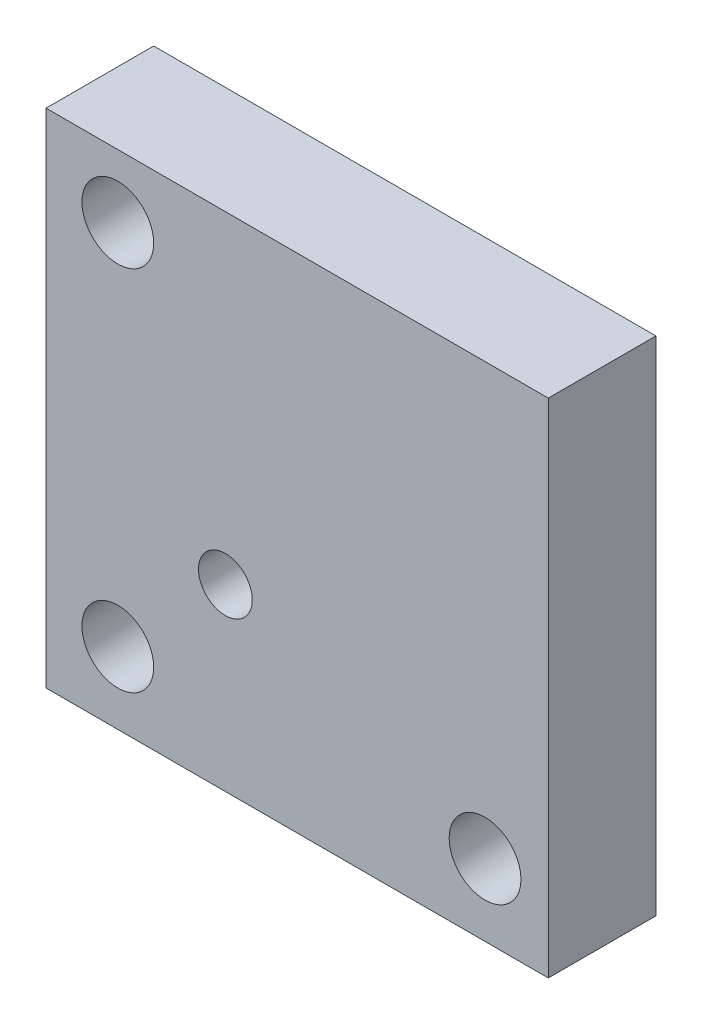
ISO-10303-21;
HEADER;
FILE_DESCRIPTION(('STEP AP214'),'2;1');
FILE_NAME('part.step','',(''),(''),'','','');
FILE_SCHEMA(('AUTOMOTIVE_DESIGN { 1 0 10303 214 1 1 1 1 }'));
ENDSEC;
DATA;
#1=APPLICATION_CONTEXT('core data for automotive mechanical design processes');
#2=APPLICATION_PROTOCOL_DEFINITION('international standard','automotive_design',2000,#1);
#3=PRODUCT_CONTEXT('',#1,'mechanical');
#4=PRODUCT('Part','Part','',(#3));
#5=PRODUCT_RELATED_PRODUCT_CATEGORY('part','',(#4));
#6=PRODUCT_DEFINITION_FORMATION('','',#4);
#7=PRODUCT_DEFINITION_CONTEXT('part definition',#1,'design');
#8=PRODUCT_DEFINITION('design','',#6,#7);
#9=PRODUCT_DEFINITION_SHAPE('','',#8);
#10=(LENGTH_UNIT() NAMED_UNIT(*) SI_UNIT(.MILLI.,.METRE.));
#11=(NAMED_UNIT(*) PLANE_ANGLE_UNIT() SI_UNIT($,.RADIAN.));
#12=(NAMED_UNIT(*) SI_UNIT($,.STERADIAN.) SOLID_ANGLE_UNIT());
#13=UNCERTAINTY_MEASURE_WITH_UNIT(LENGTH_MEASURE(1.E-05),#10,'distance_accuracy_value','');
#14=(GEOMETRIC_REPRESENTATION_CONTEXT(3) GLOBAL_UNCERTAINTY_ASSIGNED_CONTEXT((#13)) GLOBAL_UNIT_ASSIGNED_CONTEXT((#10,
#11,#12)) REPRESENTATION_CONTEXT('',''));
#15=CARTESIAN_POINT('',(0.,0.,0.));
#16=DIRECTION('',(0.,0.,1.));
#17=DIRECTION('',(1.,0.,0.));
#18=AXIS2_PLACEMENT_3D('',#15,#16,#17);
#19=CARTESIAN_POINT('',(22.225,-22.225,9.525));
#20=DIRECTION('',(-1.,0.,0.));
#21=DIRECTION('',(0.,0.,1.));
#22=AXIS2_PLACEMENT_3D('',#19,#20,#21);
#23=PLANE('',#22);
#24=DIRECTION('',(0.,1.,0.));
#25=VECTOR('',#24,1.);
#26=CARTESIAN_POINT('',(22.225,-22.225,0.));
#27=LINE('',#26,#25);
#28=CARTESIAN_POINT('',(22.225,-22.225,0.));
#29=VERTEX_POINT('',#28);
#30=CARTESIAN_POINT('',(22.225,22.225,0.));
#31=VERTEX_POINT('',#30);
#32=EDGE_CURVE('E104',#29,#31,#27,.T.);
#33=ORIENTED_EDGE('',*,*,#32,.T.);
#34=DIRECTION('',(0.,0.,-1.));
#35=VECTOR('',#34,1.);
#36=CARTESIAN_POINT('',(22.225,22.225,9.525));
#37=LINE('',#36,#35);
#38=CARTESIAN_POINT('',(22.225,22.225,9.525));
#39=VERTEX_POINT('',#38);
#40=EDGE_CURVE('E11',#39,#31,#37,.T.);
#41=ORIENTED_EDGE('',*,*,#40,.F.);
#42=DIRECTION('',(0.,1.,0.));
#43=VECTOR('',#42,1.);
#44=CARTESIAN_POINT('',(22.225,-22.225,9.525));
#45=LINE('',#44,#43);
#46=CARTESIAN_POINT('',(22.225,-22.225,9.525));
#47=VERTEX_POINT('',#46);
#48=EDGE_CURVE('E91',#47,#39,#45,.T.);
#49=ORIENTED_EDGE('',*,*,#48,.F.);
#50=DIRECTION('',(0.,0.,-1.));
#51=VECTOR('',#50,1.);
#52=CARTESIAN_POINT('',(22.225,-22.225,9.525));
#53=LINE('',#52,#51);
#54=EDGE_CURVE('E100',#47,#29,#53,.T.);
#55=ORIENTED_EDGE('',*,*,#54,.T.);
#56=EDGE_LOOP('',(#33,#41,#49,#55));
#57=FACE_BOUND('',#56,.T.);
#58=ADVANCED_FACE('F39',(#57),#23,.F.);
#59=CARTESIAN_POINT('',(-22.225,22.225,9.525));
#60=DIRECTION('',(0.,-1.,0.));
#61=DIRECTION('',(0.,0.,-1.));
#62=AXIS2_PLACEMENT_3D('',#59,#60,#61);
#63=PLANE('',#62);
#64=DIRECTION('',(-1.,0.,0.));
#65=VECTOR('',#64,1.);
#66=CARTESIAN_POINT('',(-22.225,22.225,0.));
#67=LINE('',#66,#65);
#68=CARTESIAN_POINT('',(-22.225,22.225,0.));
#69=VERTEX_POINT('',#68);
#70=EDGE_CURVE('E95',#31,#69,#67,.T.);
#71=ORIENTED_EDGE('',*,*,#70,.T.);
#72=DIRECTION('',(0.,0.,-1.));
#73=VECTOR('',#72,1.);
#74=CARTESIAN_POINT('',(-22.225,22.225,9.525));
#75=LINE('',#74,#73);
#76=CARTESIAN_POINT('',(-22.225,22.225,9.525));
#77=VERTEX_POINT('',#76);
#78=EDGE_CURVE('E48',#77,#69,#75,.T.);
#79=ORIENTED_EDGE('',*,*,#78,.F.);
#80=DIRECTION('',(-1.,0.,0.));
#81=VECTOR('',#80,1.);
#82=CARTESIAN_POINT('',(-22.225,22.225,9.525));
#83=LINE('',#82,#81);
#84=EDGE_CURVE('E86',#39,#77,#83,.T.);
#85=ORIENTED_EDGE('',*,*,#84,.F.);
#86=ORIENTED_EDGE('',*,*,#40,.T.);
#87=EDGE_LOOP('',(#71,#79,#85,#86));
#88=FACE_BOUND('',#87,.T.);
#89=ADVANCED_FACE('F94',(#88),#63,.F.);
#90=CARTESIAN_POINT('',(-22.225,-22.225,9.525));
#91=DIRECTION('',(1.,0.,0.));
#92=DIRECTION('',(0.,0.,-1.));
#93=AXIS2_PLACEMENT_3D('',#90,#91,#92);
#94=PLANE('',#93);
#95=DIRECTION('',(0.,-1.,0.));
#96=VECTOR('',#95,1.);
#97=CARTESIAN_POINT('',(-22.225,-22.225,0.));
#98=LINE('',#97,#96);
#99=CARTESIAN_POINT('',(-22.225,-22.225,0.));
#100=VERTEX_POINT('',#99);
#101=EDGE_CURVE('E73',#69,#100,#98,.T.);
#102=ORIENTED_EDGE('',*,*,#101,.T.);
#103=DIRECTION('',(0.,0.,-1.));
#104=VECTOR('',#103,1.);
#105=CARTESIAN_POINT('',(-22.225,-22.225,9.525));
#106=LINE('',#105,#104);
#107=CARTESIAN_POINT('',(-22.225,-22.225,9.525));
#108=VERTEX_POINT('',#107);
#109=EDGE_CURVE('E96',#108,#100,#106,.T.);
#110=ORIENTED_EDGE('',*,*,#109,.F.);
#111=DIRECTION('',(0.,-1.,0.));
#112=VECTOR('',#111,1.);
#113=CARTESIAN_POINT('',(-22.225,-22.225,9.525));
#114=LINE('',#113,#112);
#115=EDGE_CURVE('E89',#77,#108,#114,.T.);
#116=ORIENTED_EDGE('',*,*,#115,.F.);
#117=ORIENTED_EDGE('',*,*,#78,.T.);
#118=EDGE_LOOP('',(#102,#110,#116,#117));
#119=FACE_BOUND('',#118,.T.);
#120=ADVANCED_FACE('F98',(#119),#94,.F.);
#121=CARTESIAN_POINT('',(-22.225,-22.225,9.525));
#122=DIRECTION('',(0.,1.,0.));
#123=DIRECTION('',(0.,0.,1.));
#124=AXIS2_PLACEMENT_3D('',#121,#122,#123);
#125=PLANE('',#124);
#126=DIRECTION('',(1.,0.,0.));
#127=VECTOR('',#126,1.);
#128=CARTESIAN_POINT('',(-22.225,-22.225,0.));
#129=LINE('',#128,#127);
#130=EDGE_CURVE('E79',#100,#29,#129,.T.);
#131=ORIENTED_EDGE('',*,*,#130,.T.);
#132=ORIENTED_EDGE('',*,*,#54,.F.);
#133=DIRECTION('',(1.,0.,0.));
#134=VECTOR('',#133,1.);
#135=CARTESIAN_POINT('',(-22.225,-22.225,9.525));
#136=LINE('',#135,#134);
#137=EDGE_CURVE('E56',#108,#47,#136,.T.);
#138=ORIENTED_EDGE('',*,*,#137,.F.);
#139=ORIENTED_EDGE('',*,*,#109,.T.);
#140=EDGE_LOOP('',(#131,#132,#138,#139));
#141=FACE_BOUND('',#140,.T.);
#142=ADVANCED_FACE('F112',(#141),#125,.F.);
#143=CARTESIAN_POINT('',(0.,0.,9.525));
#144=DIRECTION('',(0.,0.,-1.));
#145=DIRECTION('',(-1.,0.,0.));
#146=AXIS2_PLACEMENT_3D('',#143,#144,#145);
#147=PLANE('',#146);
#148=CARTESIAN_POINT('',(-6.35565314094122,-6.35565314094124,9.525));
#149=DIRECTION('',(0.,0.,-1.));
#150=DIRECTION('',(-1.,0.,0.));
#151=AXIS2_PLACEMENT_3D('',#148,#149,#150);
#152=CIRCLE('',#151,2.38125);
#153=CARTESIAN_POINT('',(-8.73690314094122,-6.35565314094124,9.525));
#154=VERTEX_POINT('',#153);
#155=EDGE_CURVE('E170',#154,#154,#152,.T.);
#156=ORIENTED_EDGE('',*,*,#155,.T.);
#157=EDGE_LOOP('',(#156));
#158=FACE_BOUND('',#157,.T.);
#159=CARTESIAN_POINT('',(-15.875,16.6260831511321,9.525));
#160=DIRECTION('',(0.,0.,-1.));
#161=DIRECTION('',(-1.,0.,0.));
#162=AXIS2_PLACEMENT_3D('',#159,#160,#161);
#163=CIRCLE('',#162,3.175);
#164=CARTESIAN_POINT('',(-19.05,16.6260831511321,9.525));
#165=VERTEX_POINT('',#164);
#166=EDGE_CURVE('E147',#165,#165,#163,.T.);
#167=ORIENTED_EDGE('',*,*,#166,.T.);
#168=EDGE_LOOP('',(#167));
#169=FACE_BOUND('',#168,.T.);
#170=CARTESIAN_POINT('',(16.6260831511321,-15.875,9.525));
#171=DIRECTION('',(0.,0.,-1.));
#172=DIRECTION('',(-1.,0.,0.));
#173=AXIS2_PLACEMENT_3D('',#170,#171,#172);
#174=CIRCLE('',#173,3.175);
#175=CARTESIAN_POINT('',(13.4510831511321,-15.875,9.525));
#176=VERTEX_POINT('',#175);
#177=EDGE_CURVE('E132',#176,#176,#174,.T.);
#178=ORIENTED_EDGE('',*,*,#177,.T.);
#179=EDGE_LOOP('',(#178));
#180=FACE_BOUND('',#179,.T.);
#181=CARTESIAN_POINT('',(-15.875,-15.875,9.525));
#182=DIRECTION('',(0.,0.,-1.));
#183=DIRECTION('',(-1.,0.,0.));
#184=AXIS2_PLACEMENT_3D('',#181,#182,#183);
#185=CIRCLE('',#184,3.175);
#186=CARTESIAN_POINT('',(-19.05,-15.875,9.525));
#187=VERTEX_POINT('',#186);
#188=EDGE_CURVE('E107',#187,#187,#185,.T.);
#189=ORIENTED_EDGE('',*,*,#188,.T.);
#190=EDGE_LOOP('',(#189));
#191=FACE_BOUND('',#190,.T.);
#192=ORIENTED_EDGE('',*,*,#48,.T.);
#193=ORIENTED_EDGE('',*,*,#84,.T.);
#194=ORIENTED_EDGE('',*,*,#115,.T.);
#195=ORIENTED_EDGE('',*,*,#137,.T.);
#196=EDGE_LOOP('',(#192,#193,#194,#195));
#197=FACE_BOUND('',#196,.T.);
#198=ADVANCED_FACE('F87',(#158,#169,#180,#191,#197),#147,.F.);
#199=CARTESIAN_POINT('',(0.,0.,0.));
#200=DIRECTION('',(0.,0.,-1.));
#201=DIRECTION('',(-1.,0.,0.));
#202=AXIS2_PLACEMENT_3D('',#199,#200,#201);
#203=PLANE('',#202);
#204=CARTESIAN_POINT('',(-6.35565314094122,-6.35565314094124,0.));
#205=DIRECTION('',(0.,0.,-1.));
#206=DIRECTION('',(-1.,0.,0.));
#207=AXIS2_PLACEMENT_3D('',#204,#205,#206);
#208=CIRCLE('',#207,6.35);
#209=CARTESIAN_POINT('',(-12.7056531409412,-6.35565314094124,0.));
#210=VERTEX_POINT('',#209);
#211=EDGE_CURVE('E163',#210,#210,#208,.T.);
#212=ORIENTED_EDGE('',*,*,#211,.F.);
#213=EDGE_LOOP('',(#212));
#214=FACE_BOUND('',#213,.T.);
#215=CARTESIAN_POINT('',(-15.875,16.6260831511321,0.));
#216=DIRECTION('',(0.,0.,-1.));
#217=DIRECTION('',(-1.,0.,0.));
#218=AXIS2_PLACEMENT_3D('',#215,#216,#217);
#219=CIRCLE('',#218,3.937);
#220=CARTESIAN_POINT('',(-19.812,16.6260831511321,0.));
#221=VERTEX_POINT('',#220);
#222=EDGE_CURVE('E159',#221,#221,#219,.T.);
#223=ORIENTED_EDGE('',*,*,#222,.F.);
#224=EDGE_LOOP('',(#223));
#225=FACE_BOUND('',#224,.T.);
#226=CARTESIAN_POINT('',(16.6260831511321,-15.875,0.));
#227=DIRECTION('',(0.,0.,-1.));
#228=DIRECTION('',(-1.,0.,0.));
#229=AXIS2_PLACEMENT_3D('',#226,#227,#228);
#230=CIRCLE('',#229,3.937);
#231=CARTESIAN_POINT('',(12.6890831511321,-15.875,0.));
#232=VERTEX_POINT('',#231);
#233=EDGE_CURVE('E144',#232,#232,#230,.T.);
#234=ORIENTED_EDGE('',*,*,#233,.F.);
#235=EDGE_LOOP('',(#234));
#236=FACE_BOUND('',#235,.T.);
#237=CARTESIAN_POINT('',(-15.875,-15.875,0.));
#238=DIRECTION('',(0.,0.,-1.));
#239=DIRECTION('',(-1.,0.,0.));
#240=AXIS2_PLACEMENT_3D('',#237,#238,#239);
#241=CIRCLE('',#240,3.937);
#242=CARTESIAN_POINT('',(-19.812,-15.875,0.));
#243=VERTEX_POINT('',#242);
#244=EDGE_CURVE('E129',#243,#243,#241,.T.);
#245=ORIENTED_EDGE('',*,*,#244,.F.);
#246=EDGE_LOOP('',(#245));
#247=FACE_BOUND('',#246,.T.);
#248=ORIENTED_EDGE('',*,*,#32,.F.);
#249=ORIENTED_EDGE('',*,*,#130,.F.);
#250=ORIENTED_EDGE('',*,*,#101,.F.);
#251=ORIENTED_EDGE('',*,*,#70,.F.);
#252=EDGE_LOOP('',(#248,#249,#250,#251));
#253=FACE_BOUND('',#252,.T.);
#254=ADVANCED_FACE('F115',(#214,#225,#236,#247,#253),#203,.T.);
#255=CARTESIAN_POINT('',(-15.875,-15.875,0.));
#256=DIRECTION('',(0.,0.,-1.));
#257=DIRECTION('',(-1.,0.,0.));
#258=AXIS2_PLACEMENT_3D('',#255,#256,#257);
#259=CYLINDRICAL_SURFACE('',#258,3.175);
#260=ORIENTED_EDGE('',*,*,#188,.F.);
#261=EDGE_LOOP('',(#260));
#262=FACE_BOUND('',#261,.T.);
#263=CARTESIAN_POINT('',(-15.875,-15.875,0.507999999999998));
#264=DIRECTION('',(0.,0.,-1.));
#265=DIRECTION('',(-1.,0.,0.));
#266=AXIS2_PLACEMENT_3D('',#263,#264,#265);
#267=CIRCLE('',#266,3.175);
#268=CARTESIAN_POINT('',(-19.05,-15.875,0.507999999999998));
#269=VERTEX_POINT('',#268);
#270=EDGE_CURVE('E120',#269,#269,#267,.T.);
#271=ORIENTED_EDGE('',*,*,#270,.T.);
#272=EDGE_LOOP('',(#271));
#273=FACE_BOUND('',#272,.T.);
#274=ADVANCED_FACE('F197',(#262,#273),#259,.F.);
#275=CARTESIAN_POINT('',(-12.065,-15.875,0.507999999999998));
#276=DIRECTION('',(0.,0.,1.));
#277=DIRECTION('',(1.,0.,0.));
#278=AXIS2_PLACEMENT_3D('',#275,#276,#277);
#279=PLANE('',#278);
#280=ORIENTED_EDGE('',*,*,#270,.F.);
#281=EDGE_LOOP('',(#280));
#282=FACE_BOUND('',#281,.T.);
#283=CARTESIAN_POINT('',(-15.875,-15.875,0.507999999999998));
#284=DIRECTION('',(0.,0.,-1.));
#285=DIRECTION('',(-1.,0.,0.));
#286=AXIS2_PLACEMENT_3D('',#283,#284,#285);
#287=CIRCLE('',#286,3.81);
#288=CARTESIAN_POINT('',(-19.685,-15.875,0.507999999999998));
#289=VERTEX_POINT('',#288);
#290=EDGE_CURVE('E123',#289,#289,#287,.T.);
#291=ORIENTED_EDGE('',*,*,#290,.T.);
#292=EDGE_LOOP('',(#291));
#293=FACE_BOUND('',#292,.T.);
#294=ADVANCED_FACE('F218',(#282,#293),#279,.F.);
#295=CARTESIAN_POINT('',(-15.875,-15.875,0.));
#296=DIRECTION('',(0.,0.,-1.));
#297=DIRECTION('',(-1.,0.,0.));
#298=AXIS2_PLACEMENT_3D('',#295,#296,#297);
#299=CYLINDRICAL_SURFACE('',#298,3.81);
#300=ORIENTED_EDGE('',*,*,#290,.F.);
#301=EDGE_LOOP('',(#300));
#302=FACE_BOUND('',#301,.T.);
#303=CARTESIAN_POINT('',(-15.875,-15.875,0.127000000000001));
#304=DIRECTION('',(0.,0.,-1.));
#305=DIRECTION('',(-1.,0.,0.));
#306=AXIS2_PLACEMENT_3D('',#303,#304,#305);
#307=CIRCLE('',#306,3.81);
#308=CARTESIAN_POINT('',(-19.685,-15.875,0.127000000000001));
#309=VERTEX_POINT('',#308);
#310=EDGE_CURVE('E126',#309,#309,#307,.T.);
#311=ORIENTED_EDGE('',*,*,#310,.T.);
#312=EDGE_LOOP('',(#311));
#313=FACE_BOUND('',#312,.T.);
#314=ADVANCED_FACE('F208',(#302,#313),#299,.F.);
#315=CARTESIAN_POINT('',(-15.875,-15.875,0.));
#316=DIRECTION('',(0.,0.,-1.));
#317=DIRECTION('',(-1.,0.,0.));
#318=AXIS2_PLACEMENT_3D('',#315,#316,#317);
#319=CONICAL_SURFACE('',#318,3.937,0.785398163397447);
#320=ORIENTED_EDGE('',*,*,#310,.F.);
#321=EDGE_LOOP('',(#320));
#322=FACE_BOUND('',#321,.T.);
#323=ORIENTED_EDGE('',*,*,#244,.T.);
#324=EDGE_LOOP('',(#323));
#325=FACE_BOUND('',#324,.T.);
#326=ADVANCED_FACE('F205',(#322,#325),#319,.F.);
#327=CARTESIAN_POINT('',(16.6260831511321,-15.875,0.));
#328=DIRECTION('',(0.,0.,-1.));
#329=DIRECTION('',(-1.,0.,0.));
#330=AXIS2_PLACEMENT_3D('',#327,#328,#329);
#331=CYLINDRICAL_SURFACE('',#330,3.175);
#332=ORIENTED_EDGE('',*,*,#177,.F.);
#333=EDGE_LOOP('',(#332));
#334=FACE_BOUND('',#333,.T.);
#335=CARTESIAN_POINT('',(16.6260831511321,-15.875,0.507999999999998));
#336=DIRECTION('',(0.,0.,-1.));
#337=DIRECTION('',(-1.,0.,0.));
#338=AXIS2_PLACEMENT_3D('',#335,#336,#337);
#339=CIRCLE('',#338,3.175);
#340=CARTESIAN_POINT('',(13.4510831511321,-15.875,0.507999999999998));
#341=VERTEX_POINT('',#340);
#342=EDGE_CURVE('E135',#341,#341,#339,.T.);
#343=ORIENTED_EDGE('',*,*,#342,.T.);
#344=EDGE_LOOP('',(#343));
#345=FACE_BOUND('',#344,.T.);
#346=ADVANCED_FACE('F207',(#334,#345),#331,.F.);
#347=CARTESIAN_POINT('',(20.4360831511321,-15.875,0.507999999999998));
#348=DIRECTION('',(0.,0.,1.));
#349=DIRECTION('',(1.,0.,0.));
#350=AXIS2_PLACEMENT_3D('',#347,#348,#349);
#351=PLANE('',#350);
#352=ORIENTED_EDGE('',*,*,#342,.F.);
#353=EDGE_LOOP('',(#352));
#354=FACE_BOUND('',#353,.T.);
#355=CARTESIAN_POINT('',(16.6260831511321,-15.875,0.507999999999998));
#356=DIRECTION('',(0.,0.,-1.));
#357=DIRECTION('',(-1.,0.,0.));
#358=AXIS2_PLACEMENT_3D('',#355,#356,#357);
#359=CIRCLE('',#358,3.80999999999999);
#360=CARTESIAN_POINT('',(12.8160831511321,-15.875,0.507999999999998));
#361=VERTEX_POINT('',#360);
#362=EDGE_CURVE('E138',#361,#361,#359,.T.);
#363=ORIENTED_EDGE('',*,*,#362,.T.);
#364=EDGE_LOOP('',(#363));
#365=FACE_BOUND('',#364,.T.);
#366=ADVANCED_FACE('F215',(#354,#365),#351,.F.);
#367=CARTESIAN_POINT('',(16.6260831511321,-15.875,0.));
#368=DIRECTION('',(0.,0.,-1.));
#369=DIRECTION('',(-1.,0.,0.));
#370=AXIS2_PLACEMENT_3D('',#367,#368,#369);
#371=CYLINDRICAL_SURFACE('',#370,3.81);
#372=ORIENTED_EDGE('',*,*,#362,.F.);
#373=EDGE_LOOP('',(#372));
#374=FACE_BOUND('',#373,.T.);
#375=CARTESIAN_POINT('',(16.6260831511321,-15.875,0.127000000000001));
#376=DIRECTION('',(0.,0.,-1.));
#377=DIRECTION('',(-1.,0.,0.));
#378=AXIS2_PLACEMENT_3D('',#375,#376,#377);
#379=CIRCLE('',#378,3.81);
#380=CARTESIAN_POINT('',(12.8160831511321,-15.875,0.127000000000001));
#381=VERTEX_POINT('',#380);
#382=EDGE_CURVE('E141',#381,#381,#379,.T.);
#383=ORIENTED_EDGE('',*,*,#382,.T.);
#384=EDGE_LOOP('',(#383));
#385=FACE_BOUND('',#384,.T.);
#386=ADVANCED_FACE('F273',(#374,#385),#371,.F.);
#387=CARTESIAN_POINT('',(16.6260831511321,-15.875,0.));
#388=DIRECTION('',(0.,0.,-1.));
#389=DIRECTION('',(-1.,0.,0.));
#390=AXIS2_PLACEMENT_3D('',#387,#388,#389);
#391=CONICAL_SURFACE('',#390,3.937,0.785398163397441);
#392=ORIENTED_EDGE('',*,*,#382,.F.);
#393=EDGE_LOOP('',(#392));
#394=FACE_BOUND('',#393,.T.);
#395=ORIENTED_EDGE('',*,*,#233,.T.);
#396=EDGE_LOOP('',(#395));
#397=FACE_BOUND('',#396,.T.);
#398=ADVANCED_FACE('F283',(#394,#397),#391,.F.);
#399=CARTESIAN_POINT('',(-15.875,16.6260831511321,0.));
#400=DIRECTION('',(0.,0.,-1.));
#401=DIRECTION('',(-1.,0.,0.));
#402=AXIS2_PLACEMENT_3D('',#399,#400,#401);
#403=CYLINDRICAL_SURFACE('',#402,3.175);
#404=ORIENTED_EDGE('',*,*,#166,.F.);
#405=EDGE_LOOP('',(#404));
#406=FACE_BOUND('',#405,.T.);
#407=CARTESIAN_POINT('',(-15.875,16.6260831511321,0.507999999999998));
#408=DIRECTION('',(0.,0.,-1.));
#409=DIRECTION('',(-1.,0.,0.));
#410=AXIS2_PLACEMENT_3D('',#407,#408,#409);
#411=CIRCLE('',#410,3.175);
#412=CARTESIAN_POINT('',(-19.05,16.6260831511321,0.507999999999998));
#413=VERTEX_POINT('',#412);
#414=EDGE_CURVE('E150',#413,#413,#411,.T.);
#415=ORIENTED_EDGE('',*,*,#414,.T.);
#416=EDGE_LOOP('',(#415));
#417=FACE_BOUND('',#416,.T.);
#418=ADVANCED_FACE('F293',(#406,#417),#403,.F.);
#419=CARTESIAN_POINT('',(-12.065,16.6260831511321,0.507999999999998));
#420=DIRECTION('',(0.,0.,1.));
#421=DIRECTION('',(1.,0.,0.));
#422=AXIS2_PLACEMENT_3D('',#419,#420,#421);
#423=PLANE('',#422);
#424=ORIENTED_EDGE('',*,*,#414,.F.);
#425=EDGE_LOOP('',(#424));
#426=FACE_BOUND('',#425,.T.);
#427=CARTESIAN_POINT('',(-15.875,16.6260831511321,0.507999999999998));
#428=DIRECTION('',(0.,0.,-1.));
#429=DIRECTION('',(-1.,0.,0.));
#430=AXIS2_PLACEMENT_3D('',#427,#428,#429);
#431=CIRCLE('',#430,3.81);
#432=CARTESIAN_POINT('',(-19.685,16.6260831511321,0.507999999999998));
#433=VERTEX_POINT('',#432);
#434=EDGE_CURVE('E153',#433,#433,#431,.T.);
#435=ORIENTED_EDGE('',*,*,#434,.T.);
#436=EDGE_LOOP('',(#435));
#437=FACE_BOUND('',#436,.T.);
#438=ADVANCED_FACE('F303',(#426,#437),#423,.F.);
#439=CARTESIAN_POINT('',(-15.875,16.6260831511321,0.));
#440=DIRECTION('',(0.,0.,-1.));
#441=DIRECTION('',(-1.,0.,0.));
#442=AXIS2_PLACEMENT_3D('',#439,#440,#441);
#443=CYLINDRICAL_SURFACE('',#442,3.81);
#444=ORIENTED_EDGE('',*,*,#434,.F.);
#445=EDGE_LOOP('',(#444));
#446=FACE_BOUND('',#445,.T.);
#447=CARTESIAN_POINT('',(-15.875,16.6260831511321,0.127000000000001));
#448=DIRECTION('',(0.,0.,-1.));
#449=DIRECTION('',(-1.,0.,0.));
#450=AXIS2_PLACEMENT_3D('',#447,#448,#449);
#451=CIRCLE('',#450,3.81);
#452=CARTESIAN_POINT('',(-19.685,16.6260831511321,0.127000000000001));
#453=VERTEX_POINT('',#452);
#454=EDGE_CURVE('E156',#453,#453,#451,.T.);
#455=ORIENTED_EDGE('',*,*,#454,.T.);
#456=EDGE_LOOP('',(#455));
#457=FACE_BOUND('',#456,.T.);
#458=ADVANCED_FACE('F313',(#446,#457),#443,.F.);
#459=CARTESIAN_POINT('',(-15.875,16.6260831511321,0.));
#460=DIRECTION('',(0.,0.,-1.));
#461=DIRECTION('',(-1.,0.,0.));
#462=AXIS2_PLACEMENT_3D('',#459,#460,#461);
#463=CONICAL_SURFACE('',#462,3.937,0.785398163397447);
#464=ORIENTED_EDGE('',*,*,#454,.F.);
#465=EDGE_LOOP('',(#464));
#466=FACE_BOUND('',#465,.T.);
#467=ORIENTED_EDGE('',*,*,#222,.T.);
#468=EDGE_LOOP('',(#467));
#469=FACE_BOUND('',#468,.T.);
#470=ADVANCED_FACE('F191',(#466,#469),#463,.F.);
#471=CARTESIAN_POINT('',(-6.35565314094122,-6.35565314094124,4.7752));
#472=DIRECTION('',(0.,0.,-1.));
#473=DIRECTION('',(-1.,0.,0.));
#474=AXIS2_PLACEMENT_3D('',#471,#472,#473);
#475=CYLINDRICAL_SURFACE('',#474,6.35);
#476=CARTESIAN_POINT('',(-6.35565314094122,-6.35565314094124,4.7752));
#477=DIRECTION('',(0.,0.,-1.));
#478=DIRECTION('',(-1.,0.,0.));
#479=AXIS2_PLACEMENT_3D('',#476,#477,#478);
#480=CIRCLE('',#479,6.35);
#481=CARTESIAN_POINT('',(-12.7056531409412,-6.35565314094124,4.7752));
#482=VERTEX_POINT('',#481);
#483=EDGE_CURVE('E162',#482,#482,#480,.T.);
#484=ORIENTED_EDGE('',*,*,#483,.F.);
#485=EDGE_LOOP('',(#484));
#486=FACE_BOUND('',#485,.T.);
#487=ORIENTED_EDGE('',*,*,#211,.T.);
#488=EDGE_LOOP('',(#487));
#489=FACE_BOUND('',#488,.T.);
#490=ADVANCED_FACE('F185',(#486,#489),#475,.F.);
#491=CARTESIAN_POINT('',(-6.35565314094122,-6.35565314094124,4.7752));
#492=DIRECTION('',(0.,0.,-1.));
#493=DIRECTION('',(-1.,0.,0.));
#494=AXIS2_PLACEMENT_3D('',#491,#492,#493);
#495=PLANE('',#494);
#496=CARTESIAN_POINT('',(-6.35565314094122,-6.35565314094124,4.7752));
#497=DIRECTION('',(0.,0.,-1.));
#498=DIRECTION('',(-1.,0.,0.));
#499=AXIS2_PLACEMENT_3D('',#496,#497,#498);
#500=CIRCLE('',#499,2.38125);
#501=CARTESIAN_POINT('',(-8.73690314094122,-6.35565314094124,4.7752));
#502=VERTEX_POINT('',#501);
#503=EDGE_CURVE('E42',#502,#502,#500,.T.);
#504=ORIENTED_EDGE('',*,*,#503,.F.);
#505=EDGE_LOOP('',(#504));
#506=FACE_BOUND('',#505,.T.);
#507=ORIENTED_EDGE('',*,*,#483,.T.);
#508=EDGE_LOOP('',(#507));
#509=FACE_BOUND('',#508,.T.);
#510=ADVANCED_FACE('F182',(#506,#509),#495,.T.);
#511=CARTESIAN_POINT('',(-6.35565314094122,-6.35565314094124,9.525));
#512=DIRECTION('',(0.,0.,-1.));
#513=DIRECTION('',(-1.,0.,0.));
#514=AXIS2_PLACEMENT_3D('',#511,#512,#513);
#515=CYLINDRICAL_SURFACE('',#514,2.38125);
#516=CARTESIAN_POINT('',(-8.73690314094122,-6.35565314094124,4.7752));
#517=CARTESIAN_POINT('',(-8.73690314094122,-6.35565314094124,4.82467708333333));
#518=CARTESIAN_POINT('',(-8.73690314094122,-6.35565314094124,4.87415416666667));
#519=CARTESIAN_POINT('',(-8.73690314094122,-6.35565314094124,4.97310833333333));
#520=CARTESIAN_POINT('',(-8.73690314094122,-6.35565314094124,5.02258541666667));
#521=CARTESIAN_POINT('',(-8.73690314094122,-6.35565314094124,5.12153958333333));
#522=CARTESIAN_POINT('',(-8.73690314094122,-6.35565314094124,5.17101666666667));
#523=CARTESIAN_POINT('',(-8.73690314094122,-6.35565314094124,5.26997083333333));
#524=CARTESIAN_POINT('',(-8.73690314094122,-6.35565314094124,5.31944791666667));
#525=CARTESIAN_POINT('',(-8.73690314094122,-6.35565314094124,5.41840208333333));
#526=CARTESIAN_POINT('',(-8.73690314094122,-6.35565314094124,5.46787916666667));
#527=CARTESIAN_POINT('',(-8.73690314094122,-6.35565314094124,5.56683333333334));
#528=CARTESIAN_POINT('',(-8.73690314094122,-6.35565314094124,5.61631041666667));
#529=CARTESIAN_POINT('',(-8.73690314094122,-6.35565314094124,5.71526458333333));
#530=CARTESIAN_POINT('',(-8.73690314094122,-6.35565314094124,5.76474166666667));
#531=CARTESIAN_POINT('',(-8.73690314094122,-6.35565314094124,5.86369583333333));
#532=CARTESIAN_POINT('',(-8.73690314094122,-6.35565314094124,5.91317291666667));
#533=CARTESIAN_POINT('',(-8.73690314094122,-6.35565314094124,6.01212708333334));
#534=CARTESIAN_POINT('',(-8.73690314094122,-6.35565314094124,6.06160416666667));
#535=CARTESIAN_POINT('',(-8.73690314094122,-6.35565314094124,6.16055833333333));
#536=CARTESIAN_POINT('',(-8.73690314094122,-6.35565314094124,6.21003541666667));
#537=CARTESIAN_POINT('',(-8.73690314094122,-6.35565314094124,6.30898958333333));
#538=CARTESIAN_POINT('',(-8.73690314094122,-6.35565314094124,6.35846666666667));
#539=CARTESIAN_POINT('',(-8.73690314094122,-6.35565314094124,6.45742083333333));
#540=CARTESIAN_POINT('',(-8.73690314094122,-6.35565314094124,6.50689791666667));
#541=CARTESIAN_POINT('',(-8.73690314094122,-6.35565314094124,6.60585208333333));
#542=CARTESIAN_POINT('',(-8.73690314094122,-6.35565314094124,6.65532916666667));
#543=CARTESIAN_POINT('',(-8.73690314094122,-6.35565314094124,6.75428333333333));
#544=CARTESIAN_POINT('',(-8.73690314094122,-6.35565314094124,6.80376041666667));
#545=CARTESIAN_POINT('',(-8.73690314094122,-6.35565314094124,6.90271458333333));
#546=CARTESIAN_POINT('',(-8.73690314094122,-6.35565314094124,6.95219166666667));
#547=CARTESIAN_POINT('',(-8.73690314094122,-6.35565314094124,7.05114583333333));
#548=CARTESIAN_POINT('',(-8.73690314094122,-6.35565314094124,7.10062291666667));
#549=CARTESIAN_POINT('',(-8.73690314094122,-6.35565314094124,7.19957708333333));
#550=CARTESIAN_POINT('',(-8.73690314094122,-6.35565314094124,7.24905416666667));
#551=CARTESIAN_POINT('',(-8.73690314094122,-6.35565314094124,7.34800833333333));
#552=CARTESIAN_POINT('',(-8.73690314094122,-6.35565314094124,7.39748541666667));
#553=CARTESIAN_POINT('',(-8.73690314094122,-6.35565314094124,7.49643958333333));
#554=CARTESIAN_POINT('',(-8.73690314094122,-6.35565314094124,7.54591666666667));
#555=CARTESIAN_POINT('',(-8.73690314094122,-6.35565314094124,7.64487083333333));
#556=CARTESIAN_POINT('',(-8.73690314094122,-6.35565314094124,7.69434791666667));
#557=CARTESIAN_POINT('',(-8.73690314094122,-6.35565314094124,7.79330208333333));
#558=CARTESIAN_POINT('',(-8.73690314094122,-6.35565314094124,7.84277916666667));
#559=CARTESIAN_POINT('',(-8.73690314094122,-6.35565314094124,7.94173333333333));
#560=CARTESIAN_POINT('',(-8.73690314094122,-6.35565314094124,7.99121041666667));
#561=CARTESIAN_POINT('',(-8.73690314094122,-6.35565314094124,8.09016458333334));
#562=CARTESIAN_POINT('',(-8.73690314094122,-6.35565314094124,8.13964166666667));
#563=CARTESIAN_POINT('',(-8.73690314094122,-6.35565314094124,8.23859583333333));
#564=CARTESIAN_POINT('',(-8.73690314094122,-6.35565314094124,8.28807291666667));
#565=CARTESIAN_POINT('',(-8.73690314094122,-6.35565314094124,8.38702708333333));
#566=CARTESIAN_POINT('',(-8.73690314094122,-6.35565314094124,8.43650416666667));
#567=CARTESIAN_POINT('',(-8.73690314094122,-6.35565314094124,8.53545833333333));
#568=CARTESIAN_POINT('',(-8.73690314094122,-6.35565314094124,8.58493541666667));
#569=CARTESIAN_POINT('',(-8.73690314094122,-6.35565314094124,8.68388958333333));
#570=CARTESIAN_POINT('',(-8.73690314094122,-6.35565314094124,8.73336666666667));
#571=CARTESIAN_POINT('',(-8.73690314094122,-6.35565314094124,8.83232083333334));
#572=CARTESIAN_POINT('',(-8.73690314094122,-6.35565314094124,8.88179791666667));
#573=CARTESIAN_POINT('',(-8.73690314094122,-6.35565314094124,8.98075208333334));
#574=CARTESIAN_POINT('',(-8.73690314094122,-6.35565314094124,9.03022916666667));
#575=CARTESIAN_POINT('',(-8.73690314094122,-6.35565314094124,9.12918333333334));
#576=CARTESIAN_POINT('',(-8.73690314094122,-6.35565314094124,9.17866041666667));
#577=CARTESIAN_POINT('',(-8.73690314094122,-6.35565314094124,9.27761458333334));
#578=CARTESIAN_POINT('',(-8.73690314094122,-6.35565314094124,9.32709166666667));
#579=CARTESIAN_POINT('',(-8.73690314094122,-6.35565314094124,9.42604583333333));
#580=CARTESIAN_POINT('',(-8.73690314094122,-6.35565314094124,9.47552291666667));
#581=CARTESIAN_POINT('',(-8.73690314094122,-6.35565314094124,9.525));
#582=B_SPLINE_CURVE_WITH_KNOTS('',3,(#516,#517,#518,#519,#520,#521,#522,#523,#524,#525,#526,
#527,#528,#529,#530,#531,#532,#533,#534,#535,#536,#537,#538,#539,#540,#541,#542,#543,#544,#545,
#546,#547,#548,#549,#550,#551,#552,#553,#554,#555,#556,#557,#558,#559,#560,#561,#562,#563,#564,
#565,#566,#567,#568,#569,#570,#571,#572,#573,#574,#575,#576,#577,#578,#579,#580,#581),
.UNSPECIFIED.,.F.,.F.,(4,2,2,2,2,2,2,2,2,2,2,2,2,2,2,2,2,2,2,2,2,2,2,2,2,2,2,2,2,2,2,2,4),(0.,
0.14843125,0.2968625,0.44529375,0.593725,0.742156250000001,0.8905875,1.03901875,1.18745,
1.33588125,1.4843125,1.63274375,1.781175,1.92960625,2.0780375,2.22646875,2.3749,2.52333125,
2.6717625,2.82019375,2.968625,3.11705625,3.2654875,3.41391875,3.56235,3.71078125,3.8592125,
4.00764375,4.156075,4.30450625,4.4529375,4.60136875,4.7498),.UNSPECIFIED.);
#583=EDGE_CURVE('BSEAM179',#502,#154,#582,.T.);
#584=ORIENTED_EDGE('',*,*,#503,.T.);
#585=ORIENTED_EDGE('',*,*,#155,.F.);
#586=ORIENTED_EDGE('',*,*,#583,.T.);
#587=ORIENTED_EDGE('',*,*,#583,.F.);
#588=EDGE_LOOP('',(#584,#586,#585,#587));
#589=FACE_BOUND('',#588,.T.);
#590=ADVANCED_FACE('F179',(#589),#515,.F.);
#591=CLOSED_SHELL('',(#58,#89,#120,#142,#198,#254,#274,#294,#314,#326,#346,#366,#386,#398,#418,
#438,#458,#470,#490,#510,#590));
#592=MANIFOLD_SOLID_BREP('B2',#591);
#593=ADVANCED_BREP_SHAPE_REPRESENTATION('',(#18,#592),#14);
#594=SHAPE_DEFINITION_REPRESENTATION(#9,#593);
ENDSEC;
END-ISO-10303-21;
